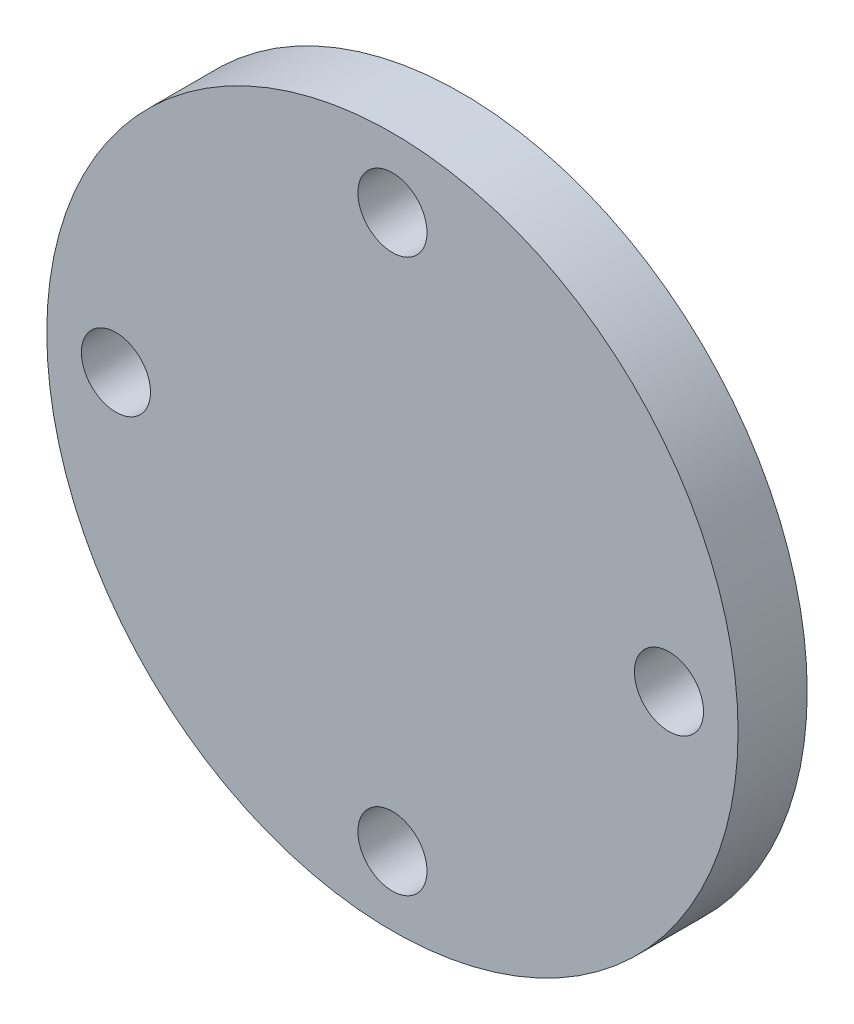
ISO-10303-21;
HEADER;
FILE_DESCRIPTION(('STEP AP214'),'2;1');
FILE_NAME('part.step','',(''),(''),'','','');
FILE_SCHEMA(('AUTOMOTIVE_DESIGN { 1 0 10303 214 1 1 1 1 }'));
ENDSEC;
DATA;
#1=APPLICATION_CONTEXT('core data for automotive mechanical design processes');
#2=APPLICATION_PROTOCOL_DEFINITION('international standard','automotive_design',2000,#1);
#3=PRODUCT_CONTEXT('',#1,'mechanical');
#4=PRODUCT('Part','Part','',(#3));
#5=PRODUCT_RELATED_PRODUCT_CATEGORY('part','',(#4));
#6=PRODUCT_DEFINITION_FORMATION('','',#4);
#7=PRODUCT_DEFINITION_CONTEXT('part definition',#1,'design');
#8=PRODUCT_DEFINITION('design','',#6,#7);
#9=PRODUCT_DEFINITION_SHAPE('','',#8);
#10=(LENGTH_UNIT() NAMED_UNIT(*) SI_UNIT(.MILLI.,.METRE.));
#11=(NAMED_UNIT(*) PLANE_ANGLE_UNIT() SI_UNIT($,.RADIAN.));
#12=(NAMED_UNIT(*) SI_UNIT($,.STERADIAN.) SOLID_ANGLE_UNIT());
#13=UNCERTAINTY_MEASURE_WITH_UNIT(LENGTH_MEASURE(1.E-05),#10,'distance_accuracy_value','');
#14=(GEOMETRIC_REPRESENTATION_CONTEXT(3) GLOBAL_UNCERTAINTY_ASSIGNED_CONTEXT((#13)) GLOBAL_UNIT_ASSIGNED_CONTEXT((#10,
#11,#12)) REPRESENTATION_CONTEXT('',''));
#15=CARTESIAN_POINT('',(0.,0.,0.));
#16=DIRECTION('',(0.,0.,1.));
#17=DIRECTION('',(1.,0.,0.));
#18=AXIS2_PLACEMENT_3D('',#15,#16,#17);
#19=CARTESIAN_POINT('',(0.,0.,20.));
#20=DIRECTION('',(0.,0.,-1.));
#21=DIRECTION('',(-1.,0.,0.));
#22=AXIS2_PLACEMENT_3D('',#19,#20,#21);
#23=CYLINDRICAL_SURFACE('',#22,100.);
#24=CARTESIAN_POINT('',(0.,0.,20.));
#25=DIRECTION('',(0.,0.,1.));
#26=DIRECTION('',(1.,0.,0.));
#27=AXIS2_PLACEMENT_3D('',#24,#25,#26);
#28=CIRCLE('',#27,100.);
#29=CARTESIAN_POINT('',(100.,0.,20.));
#30=VERTEX_POINT('',#29);
#31=EDGE_CURVE('E10',#30,#30,#28,.T.);
#32=ORIENTED_EDGE('',*,*,#31,.F.);
#33=EDGE_LOOP('',(#32));
#34=FACE_BOUND('',#33,.T.);
#35=CARTESIAN_POINT('',(0.,0.,0.));
#36=DIRECTION('',(0.,0.,1.));
#37=DIRECTION('',(1.,0.,0.));
#38=AXIS2_PLACEMENT_3D('',#35,#36,#37);
#39=CIRCLE('',#38,100.);
#40=CARTESIAN_POINT('',(100.,0.,0.));
#41=VERTEX_POINT('',#40);
#42=EDGE_CURVE('E37',#41,#41,#39,.T.);
#43=ORIENTED_EDGE('',*,*,#42,.T.);
#44=EDGE_LOOP('',(#43));
#45=FACE_BOUND('',#44,.T.);
#46=ADVANCED_FACE('F40',(#34,#45),#23,.T.);
#47=CARTESIAN_POINT('',(0.,0.,20.));
#48=DIRECTION('',(0.,0.,1.));
#49=DIRECTION('',(1.,0.,0.));
#50=AXIS2_PLACEMENT_3D('',#47,#48,#49);
#51=PLANE('',#50);
#52=CARTESIAN_POINT('',(80.,0.,20.));
#53=DIRECTION('',(0.,0.,1.));
#54=DIRECTION('',(1.,0.,0.));
#55=AXIS2_PLACEMENT_3D('',#52,#53,#54);
#56=CIRCLE('',#55,10.);
#57=CARTESIAN_POINT('',(90.,0.,20.));
#58=VERTEX_POINT('',#57);
#59=EDGE_CURVE('E66',#58,#58,#56,.T.);
#60=ORIENTED_EDGE('',*,*,#59,.F.);
#61=EDGE_LOOP('',(#60));
#62=FACE_BOUND('',#61,.T.);
#63=CARTESIAN_POINT('',(0.,80.,20.));
#64=DIRECTION('',(0.,0.,1.));
#65=DIRECTION('',(1.,0.,0.));
#66=AXIS2_PLACEMENT_3D('',#63,#64,#65);
#67=CIRCLE('',#66,10.);
#68=CARTESIAN_POINT('',(9.99999999999999,80.,20.));
#69=VERTEX_POINT('',#68);
#70=EDGE_CURVE('E64',#69,#69,#67,.T.);
#71=ORIENTED_EDGE('',*,*,#70,.F.);
#72=EDGE_LOOP('',(#71));
#73=FACE_BOUND('',#72,.T.);
#74=CARTESIAN_POINT('',(0.,-80.,20.));
#75=DIRECTION('',(0.,0.,1.));
#76=DIRECTION('',(1.,0.,0.));
#77=AXIS2_PLACEMENT_3D('',#74,#75,#76);
#78=CIRCLE('',#77,10.);
#79=CARTESIAN_POINT('',(9.99999999999999,-80.,20.));
#80=VERTEX_POINT('',#79);
#81=EDGE_CURVE('E60',#80,#80,#78,.T.);
#82=ORIENTED_EDGE('',*,*,#81,.F.);
#83=EDGE_LOOP('',(#82));
#84=FACE_BOUND('',#83,.T.);
#85=CARTESIAN_POINT('',(-80.,0.,20.));
#86=DIRECTION('',(0.,0.,1.));
#87=DIRECTION('',(1.,0.,0.));
#88=AXIS2_PLACEMENT_3D('',#85,#86,#87);
#89=CIRCLE('',#88,10.);
#90=CARTESIAN_POINT('',(-70.,0.,20.));
#91=VERTEX_POINT('',#90);
#92=EDGE_CURVE('E51',#91,#91,#89,.T.);
#93=ORIENTED_EDGE('',*,*,#92,.F.);
#94=EDGE_LOOP('',(#93));
#95=FACE_BOUND('',#94,.T.);
#96=ORIENTED_EDGE('',*,*,#31,.T.);
#97=EDGE_LOOP('',(#96));
#98=FACE_BOUND('',#97,.T.);
#99=ADVANCED_FACE('F73',(#62,#73,#84,#95,#98),#51,.T.);
#100=CARTESIAN_POINT('',(0.,0.,0.));
#101=DIRECTION('',(0.,0.,1.));
#102=DIRECTION('',(1.,0.,0.));
#103=AXIS2_PLACEMENT_3D('',#100,#101,#102);
#104=PLANE('',#103);
#105=ORIENTED_EDGE('',*,*,#42,.F.);
#106=EDGE_LOOP('',(#105));
#107=FACE_BOUND('',#106,.T.);
#108=ADVANCED_FACE('F79',(#107),#104,.F.);
#109=CARTESIAN_POINT('',(-80.,0.,2.));
#110=DIRECTION('',(0.,0.,-1.));
#111=DIRECTION('',(-1.,0.,0.));
#112=AXIS2_PLACEMENT_3D('',#109,#110,#111);
#113=PLANE('',#112);
#114=CARTESIAN_POINT('',(-80.,0.,2.));
#115=DIRECTION('',(0.,0.,1.));
#116=DIRECTION('',(1.,0.,0.));
#117=AXIS2_PLACEMENT_3D('',#114,#115,#116);
#118=CIRCLE('',#117,10.);
#119=CARTESIAN_POINT('',(-70.,0.,2.));
#120=VERTEX_POINT('',#119);
#121=EDGE_CURVE('E50',#120,#120,#118,.T.);
#122=ORIENTED_EDGE('',*,*,#121,.T.);
#123=EDGE_LOOP('',(#122));
#124=FACE_BOUND('',#123,.T.);
#125=ADVANCED_FACE('F90',(#124),#113,.F.);
#126=CARTESIAN_POINT('',(-80.,0.,20.));
#127=DIRECTION('',(0.,0.,1.));
#128=DIRECTION('',(1.,0.,0.));
#129=AXIS2_PLACEMENT_3D('',#126,#127,#128);
#130=CYLINDRICAL_SURFACE('',#129,10.);
#131=ORIENTED_EDGE('',*,*,#121,.F.);
#132=EDGE_LOOP('',(#131));
#133=FACE_BOUND('',#132,.T.);
#134=ORIENTED_EDGE('',*,*,#92,.T.);
#135=EDGE_LOOP('',(#134));
#136=FACE_BOUND('',#135,.T.);
#137=ADVANCED_FACE('F88',(#133,#136),#130,.F.);
#138=CARTESIAN_POINT('',(0.,-80.,2.));
#139=DIRECTION('',(0.,0.,-1.));
#140=DIRECTION('',(-1.,0.,0.));
#141=AXIS2_PLACEMENT_3D('',#138,#139,#140);
#142=PLANE('',#141);
#143=CARTESIAN_POINT('',(0.,-80.,2.));
#144=DIRECTION('',(0.,0.,1.));
#145=DIRECTION('',(1.,0.,0.));
#146=AXIS2_PLACEMENT_3D('',#143,#144,#145);
#147=CIRCLE('',#146,10.);
#148=CARTESIAN_POINT('',(10.,-80.,2.));
#149=VERTEX_POINT('',#148);
#150=EDGE_CURVE('E53',#149,#149,#147,.T.);
#151=ORIENTED_EDGE('',*,*,#150,.T.);
#152=EDGE_LOOP('',(#151));
#153=FACE_BOUND('',#152,.T.);
#154=ADVANCED_FACE('F86',(#153),#142,.F.);
#155=CARTESIAN_POINT('',(0.,-80.,20.));
#156=DIRECTION('',(0.,0.,1.));
#157=DIRECTION('',(1.,0.,0.));
#158=AXIS2_PLACEMENT_3D('',#155,#156,#157);
#159=CYLINDRICAL_SURFACE('',#158,10.);
#160=ORIENTED_EDGE('',*,*,#150,.F.);
#161=EDGE_LOOP('',(#160));
#162=FACE_BOUND('',#161,.T.);
#163=ORIENTED_EDGE('',*,*,#81,.T.);
#164=EDGE_LOOP('',(#163));
#165=FACE_BOUND('',#164,.T.);
#166=ADVANCED_FACE('F96',(#162,#165),#159,.F.);
#167=CARTESIAN_POINT('',(0.,80.,2.));
#168=DIRECTION('',(0.,0.,-1.));
#169=DIRECTION('',(-1.,0.,0.));
#170=AXIS2_PLACEMENT_3D('',#167,#168,#169);
#171=PLANE('',#170);
#172=CARTESIAN_POINT('',(0.,80.,2.));
#173=DIRECTION('',(0.,0.,1.));
#174=DIRECTION('',(1.,0.,0.));
#175=AXIS2_PLACEMENT_3D('',#172,#173,#174);
#176=CIRCLE('',#175,10.);
#177=CARTESIAN_POINT('',(10.,80.,2.));
#178=VERTEX_POINT('',#177);
#179=EDGE_CURVE('E58',#178,#178,#176,.T.);
#180=ORIENTED_EDGE('',*,*,#179,.T.);
#181=EDGE_LOOP('',(#180));
#182=FACE_BOUND('',#181,.T.);
#183=ADVANCED_FACE('F142',(#182),#171,.F.);
#184=CARTESIAN_POINT('',(0.,80.,20.));
#185=DIRECTION('',(0.,0.,1.));
#186=DIRECTION('',(1.,0.,0.));
#187=AXIS2_PLACEMENT_3D('',#184,#185,#186);
#188=CYLINDRICAL_SURFACE('',#187,10.);
#189=ORIENTED_EDGE('',*,*,#179,.F.);
#190=EDGE_LOOP('',(#189));
#191=FACE_BOUND('',#190,.T.);
#192=ORIENTED_EDGE('',*,*,#70,.T.);
#193=EDGE_LOOP('',(#192));
#194=FACE_BOUND('',#193,.T.);
#195=ADVANCED_FACE('F155',(#191,#194),#188,.F.);
#196=CARTESIAN_POINT('',(80.,0.,2.));
#197=DIRECTION('',(0.,0.,-1.));
#198=DIRECTION('',(-1.,0.,0.));
#199=AXIS2_PLACEMENT_3D('',#196,#197,#198);
#200=PLANE('',#199);
#201=CARTESIAN_POINT('',(80.,0.,2.));
#202=DIRECTION('',(0.,0.,1.));
#203=DIRECTION('',(1.,0.,0.));
#204=AXIS2_PLACEMENT_3D('',#201,#202,#203);
#205=CIRCLE('',#204,10.);
#206=CARTESIAN_POINT('',(90.,0.,2.));
#207=VERTEX_POINT('',#206);
#208=EDGE_CURVE('E67',#207,#207,#205,.T.);
#209=ORIENTED_EDGE('',*,*,#208,.T.);
#210=EDGE_LOOP('',(#209));
#211=FACE_BOUND('',#210,.T.);
#212=ADVANCED_FACE('F165',(#211),#200,.F.);
#213=CARTESIAN_POINT('',(80.,0.,20.));
#214=DIRECTION('',(0.,0.,1.));
#215=DIRECTION('',(1.,0.,0.));
#216=AXIS2_PLACEMENT_3D('',#213,#214,#215);
#217=CYLINDRICAL_SURFACE('',#216,10.);
#218=ORIENTED_EDGE('',*,*,#208,.F.);
#219=EDGE_LOOP('',(#218));
#220=FACE_BOUND('',#219,.T.);
#221=ORIENTED_EDGE('',*,*,#59,.T.);
#222=EDGE_LOOP('',(#221));
#223=FACE_BOUND('',#222,.T.);
#224=ADVANCED_FACE('F71',(#220,#223),#217,.F.);
#225=CLOSED_SHELL('',(#46,#99,#108,#125,#137,#154,#166,#183,#195,#212,#224));
#226=MANIFOLD_SOLID_BREP('B2',#225);
#227=ADVANCED_BREP_SHAPE_REPRESENTATION('',(#18,#226),#14);
#228=SHAPE_DEFINITION_REPRESENTATION(#9,#227);
ENDSEC;
END-ISO-10303-21;
